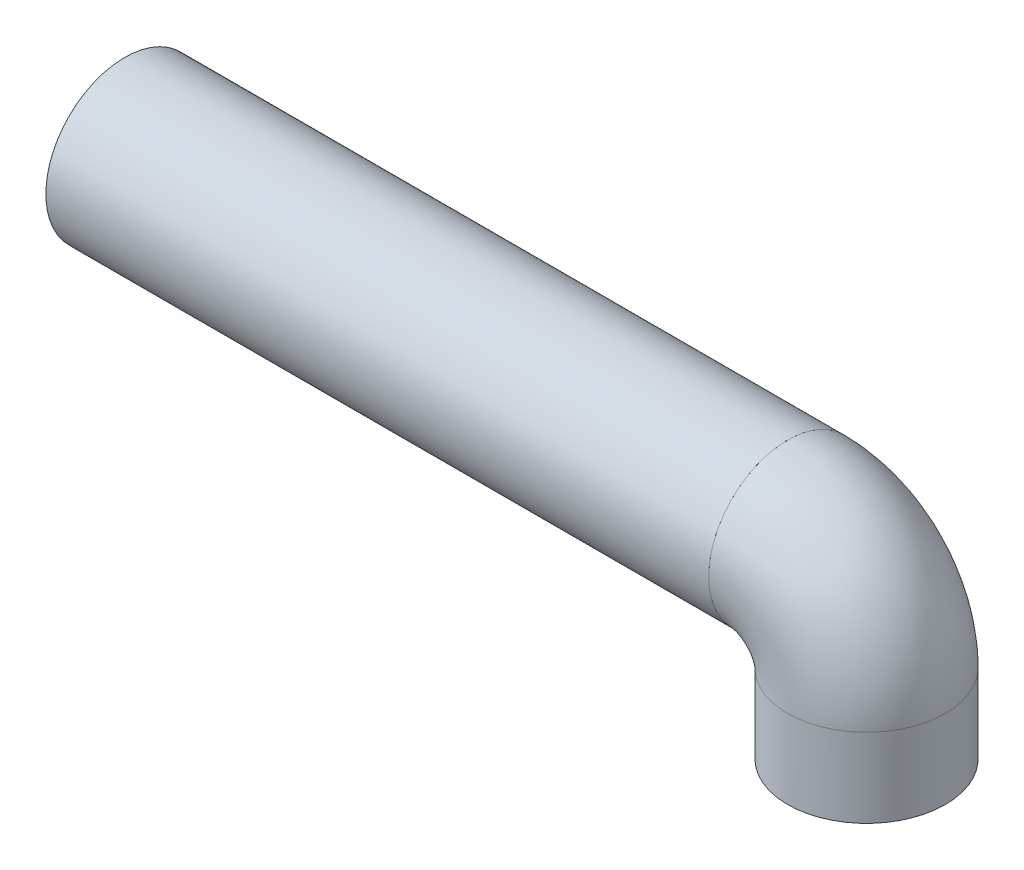
ISO-10303-21;
HEADER;
FILE_DESCRIPTION(('STEP AP214'),'2;1');
FILE_NAME('part.step','',(''),(''),'','','');
FILE_SCHEMA(('AUTOMOTIVE_DESIGN { 1 0 10303 214 1 1 1 1 }'));
ENDSEC;
DATA;
#1=APPLICATION_CONTEXT('core data for automotive mechanical design processes');
#2=APPLICATION_PROTOCOL_DEFINITION('international standard','automotive_design',2000,#1);
#3=PRODUCT_CONTEXT('',#1,'mechanical');
#4=PRODUCT('Part','Part','',(#3));
#5=PRODUCT_RELATED_PRODUCT_CATEGORY('part','',(#4));
#6=PRODUCT_DEFINITION_FORMATION('','',#4);
#7=PRODUCT_DEFINITION_CONTEXT('part definition',#1,'design');
#8=PRODUCT_DEFINITION('design','',#6,#7);
#9=PRODUCT_DEFINITION_SHAPE('','',#8);
#10=(LENGTH_UNIT() NAMED_UNIT(*) SI_UNIT(.MILLI.,.METRE.));
#11=(NAMED_UNIT(*) PLANE_ANGLE_UNIT() SI_UNIT($,.RADIAN.));
#12=(NAMED_UNIT(*) SI_UNIT($,.STERADIAN.) SOLID_ANGLE_UNIT());
#13=UNCERTAINTY_MEASURE_WITH_UNIT(LENGTH_MEASURE(1.E-05),#10,'distance_accuracy_value','');
#14=(GEOMETRIC_REPRESENTATION_CONTEXT(3) GLOBAL_UNCERTAINTY_ASSIGNED_CONTEXT((#13)) GLOBAL_UNIT_ASSIGNED_CONTEXT((#10,
#11,#12)) REPRESENTATION_CONTEXT('',''));
#15=CARTESIAN_POINT('',(0.,0.,0.));
#16=DIRECTION('',(0.,0.,1.));
#17=DIRECTION('',(1.,0.,0.));
#18=AXIS2_PLACEMENT_3D('',#15,#16,#17);
#19=CARTESIAN_POINT('',(42.,-5.,0.));
#20=DIRECTION('',(0.,0.,-1.));
#21=DIRECTION('',(-1.,0.,0.));
#22=AXIS2_PLACEMENT_3D('',#19,#20,#21);
#23=TOROIDAL_SURFACE('',#22,5.,2.5);
#24=CARTESIAN_POINT('',(41.9999999999999,0.,0.));
#25=DIRECTION('',(1.,0.,0.));
#26=DIRECTION('',(0.,1.,0.));
#27=AXIS2_PLACEMENT_3D('',#24,#25,#26);
#28=CIRCLE('',#27,2.5);
#29=CARTESIAN_POINT('',(41.9999999999999,2.5,0.));
#30=VERTEX_POINT('',#29);
#31=EDGE_CURVE('E68',#30,#30,#28,.T.);
#32=CARTESIAN_POINT('',(47.,-5.00000000000003,0.));
#33=DIRECTION('',(0.,1.,0.));
#34=DIRECTION('',(-1.,0.,0.));
#35=AXIS2_PLACEMENT_3D('',#32,#33,#34);
#36=CIRCLE('',#35,2.5);
#37=CARTESIAN_POINT('',(49.5,-5.00000000000005,0.));
#38=VERTEX_POINT('',#37);
#39=EDGE_CURVE('E80',#38,#38,#36,.T.);
#40=CARTESIAN_POINT('',(42.,-5.,0.));
#41=DIRECTION('',(0.,0.,-1.));
#42=DIRECTION('',(-1.,0.,0.));
#43=AXIS2_PLACEMENT_3D('',#40,#41,#42);
#44=CIRCLE('',#43,7.5);
#45=EDGE_CURVE('',#30,#38,#44,.T.);
#46=ORIENTED_EDGE('',*,*,#31,.F.);
#47=ORIENTED_EDGE('',*,*,#39,.F.);
#48=ORIENTED_EDGE('',*,*,#45,.T.);
#49=ORIENTED_EDGE('',*,*,#45,.F.);
#50=EDGE_LOOP('',(#46,#48,#47,#49));
#51=FACE_BOUND('',#50,.T.);
#52=ADVANCED_FACE('F61',(#51),#23,.F.);
#53=CARTESIAN_POINT('',(41.9999999999999,0.,0.));
#54=DIRECTION('',(1.,0.,0.));
#55=DIRECTION('',(0.,1.,0.));
#56=AXIS2_PLACEMENT_3D('',#53,#54,#55);
#57=PLANE('',#56);
#58=ORIENTED_EDGE('',*,*,#31,.T.);
#59=EDGE_LOOP('',(#58));
#60=FACE_BOUND('',#59,.T.);
#61=CARTESIAN_POINT('',(41.9999999999999,0.,0.));
#62=DIRECTION('',(1.,0.,0.));
#63=DIRECTION('',(0.,1.,0.));
#64=AXIS2_PLACEMENT_3D('',#61,#62,#63);
#65=CIRCLE('',#64,5.);
#66=CARTESIAN_POINT('',(42.,-5.,0.));
#67=VERTEX_POINT('',#66);
#68=EDGE_CURVE('E13',#67,#67,#65,.T.);
#69=ORIENTED_EDGE('',*,*,#68,.F.);
#70=EDGE_LOOP('',(#69));
#71=FACE_BOUND('',#70,.T.);
#72=ADVANCED_FACE('F109',(#60,#71),#57,.F.);
#73=CARTESIAN_POINT('',(37.,-5.,0.));
#74=DIRECTION('',(0.,-1.,0.));
#75=DIRECTION('',(-1.,0.,0.));
#76=AXIS2_PLACEMENT_3D('',#73,#74,#75);
#77=CIRCLE('',#76,5.);
#78=TRIMMED_CURVE('',#77,(PARAMETER_VALUE(-3.14159263251637)),
(PARAMETER_VALUE(3.14159263251637)),.T.,.PARAMETER.);
#79=CARTESIAN_POINT('',(42.,-5.,0.));
#80=DIRECTION('',(0.,0.,-1.));
#81=AXIS1_PLACEMENT('',#79,#80);
#82=SURFACE_OF_REVOLUTION('',#78,#81);
#83=ORIENTED_EDGE('',*,*,#68,.T.);
#84=CARTESIAN_POINT('',(47.,-5.00000000000003,0.));
#85=DIRECTION('',(0.,1.,0.));
#86=DIRECTION('',(-1.,0.,0.));
#87=AXIS2_PLACEMENT_3D('',#84,#85,#86);
#88=CIRCLE('',#87,5.);
#89=EDGE_CURVE('E72',#67,#67,#88,.T.);
#90=ORIENTED_EDGE('',*,*,#89,.T.);
#91=EDGE_LOOP('',(#83,#90));
#92=FACE_BOUND('',#91,.T.);
#93=ADVANCED_FACE('F105',(#92),#82,.T.);
#94=CARTESIAN_POINT('',(47.,-9.99999999999998,0.));
#95=DIRECTION('',(0.,1.,0.));
#96=DIRECTION('',(0.,0.,1.));
#97=AXIS2_PLACEMENT_3D('',#94,#95,#96);
#98=CYLINDRICAL_SURFACE('',#97,2.5);
#99=CARTESIAN_POINT('',(47.,-9.99999999999998,0.));
#100=DIRECTION('',(0.,-1.,0.));
#101=DIRECTION('',(1.,0.,0.));
#102=AXIS2_PLACEMENT_3D('',#99,#100,#101);
#103=CIRCLE('',#102,2.5);
#104=CARTESIAN_POINT('',(49.5,-10.,0.));
#105=VERTEX_POINT('',#104);
#106=EDGE_CURVE('E87',#105,#105,#103,.T.);
#107=ORIENTED_EDGE('',*,*,#106,.T.);
#108=EDGE_LOOP('',(#107));
#109=FACE_BOUND('',#108,.T.);
#110=ORIENTED_EDGE('',*,*,#39,.T.);
#111=EDGE_LOOP('',(#110));
#112=FACE_BOUND('',#111,.T.);
#113=ADVANCED_FACE('F91',(#109,#112),#98,.F.);
#114=CARTESIAN_POINT('',(47.,-9.99999999999998,0.));
#115=DIRECTION('',(0.,1.,0.));
#116=DIRECTION('',(0.,0.,1.));
#117=AXIS2_PLACEMENT_3D('',#114,#115,#116);
#118=CYLINDRICAL_SURFACE('',#117,5.);
#119=CARTESIAN_POINT('',(47.,-9.99999999999998,0.));
#120=DIRECTION('',(0.,-1.,0.));
#121=DIRECTION('',(1.,0.,0.));
#122=AXIS2_PLACEMENT_3D('',#119,#120,#121);
#123=CIRCLE('',#122,5.);
#124=CARTESIAN_POINT('',(52.,-10.,0.));
#125=VERTEX_POINT('',#124);
#126=EDGE_CURVE('E75',#125,#125,#123,.T.);
#127=ORIENTED_EDGE('',*,*,#126,.F.);
#128=EDGE_LOOP('',(#127));
#129=FACE_BOUND('',#128,.T.);
#130=ORIENTED_EDGE('',*,*,#89,.F.);
#131=EDGE_LOOP('',(#130));
#132=FACE_BOUND('',#131,.T.);
#133=ADVANCED_FACE('F73',(#129,#132),#118,.T.);
#134=CARTESIAN_POINT('',(47.,-9.99999999999998,0.));
#135=DIRECTION('',(0.,-1.,0.));
#136=DIRECTION('',(1.,0.,0.));
#137=AXIS2_PLACEMENT_3D('',#134,#135,#136);
#138=PLANE('',#137);
#139=ORIENTED_EDGE('',*,*,#106,.F.);
#140=EDGE_LOOP('',(#139));
#141=FACE_BOUND('',#140,.T.);
#142=ORIENTED_EDGE('',*,*,#126,.T.);
#143=EDGE_LOOP('',(#142));
#144=FACE_BOUND('',#143,.T.);
#145=ADVANCED_FACE('F94',(#141,#144),#138,.T.);
#146=CLOSED_SHELL('',(#52,#72,#93,#113,#133,#145));
#147=MANIFOLD_SOLID_BREP('B2',#146);
#148=CARTESIAN_POINT('',(41.9999999999999,0.,0.));
#149=DIRECTION('',(-1.,0.,0.));
#150=DIRECTION('',(0.,0.,1.));
#151=AXIS2_PLACEMENT_3D('',#148,#149,#150);
#152=CYLINDRICAL_SURFACE('',#151,2.5);
#153=CARTESIAN_POINT('',(41.9999999999999,0.,0.));
#154=DIRECTION('',(1.,0.,0.));
#155=DIRECTION('',(0.,0.,-1.));
#156=AXIS2_PLACEMENT_3D('',#153,#154,#155);
#157=CIRCLE('',#156,2.5);
#158=CARTESIAN_POINT('',(41.9999999999999,0.,-2.5));
#159=VERTEX_POINT('',#158);
#160=EDGE_CURVE('E188',#159,#159,#157,.T.);
#161=ORIENTED_EDGE('',*,*,#160,.T.);
#162=EDGE_LOOP('',(#161));
#163=FACE_BOUND('',#162,.T.);
#164=CARTESIAN_POINT('',(0.,0.,0.));
#165=DIRECTION('',(1.,0.,0.));
#166=DIRECTION('',(0.,0.,-1.));
#167=AXIS2_PLACEMENT_3D('',#164,#165,#166);
#168=CIRCLE('',#167,2.5);
#169=CARTESIAN_POINT('',(0.,0.,-2.5));
#170=VERTEX_POINT('',#169);
#171=EDGE_CURVE('E195',#170,#170,#168,.T.);
#172=ORIENTED_EDGE('',*,*,#171,.F.);
#173=EDGE_LOOP('',(#172));
#174=FACE_BOUND('',#173,.T.);
#175=ADVANCED_FACE('F180',(#163,#174),#152,.F.);
#176=CARTESIAN_POINT('',(41.9999999999999,0.,0.));
#177=DIRECTION('',(-1.,0.,0.));
#178=DIRECTION('',(0.,0.,1.));
#179=AXIS2_PLACEMENT_3D('',#176,#177,#178);
#180=CYLINDRICAL_SURFACE('',#179,5.);
#181=CARTESIAN_POINT('',(41.9999999999999,0.,0.));
#182=DIRECTION('',(1.,0.,0.));
#183=DIRECTION('',(0.,0.,-1.));
#184=AXIS2_PLACEMENT_3D('',#181,#182,#183);
#185=CIRCLE('',#184,5.);
#186=CARTESIAN_POINT('',(41.9999999999999,0.,-5.));
#187=VERTEX_POINT('',#186);
#188=EDGE_CURVE('E60',#187,#187,#185,.T.);
#189=ORIENTED_EDGE('',*,*,#188,.F.);
#190=EDGE_LOOP('',(#189));
#191=FACE_BOUND('',#190,.T.);
#192=CARTESIAN_POINT('',(0.,0.,0.));
#193=DIRECTION('',(1.,0.,0.));
#194=DIRECTION('',(0.,0.,-1.));
#195=AXIS2_PLACEMENT_3D('',#192,#193,#194);
#196=CIRCLE('',#195,5.);
#197=CARTESIAN_POINT('',(0.,0.,-5.));
#198=VERTEX_POINT('',#197);
#199=EDGE_CURVE('E183',#198,#198,#196,.T.);
#200=ORIENTED_EDGE('',*,*,#199,.T.);
#201=EDGE_LOOP('',(#200));
#202=FACE_BOUND('',#201,.T.);
#203=ADVANCED_FACE('F204',(#191,#202),#180,.T.);
#204=CARTESIAN_POINT('',(41.9999999999999,0.,0.));
#205=DIRECTION('',(1.,0.,0.));
#206=DIRECTION('',(0.,0.,-1.));
#207=AXIS2_PLACEMENT_3D('',#204,#205,#206);
#208=PLANE('',#207);
#209=ORIENTED_EDGE('',*,*,#160,.F.);
#210=EDGE_LOOP('',(#209));
#211=FACE_BOUND('',#210,.T.);
#212=ORIENTED_EDGE('',*,*,#188,.T.);
#213=EDGE_LOOP('',(#212));
#214=FACE_BOUND('',#213,.T.);
#215=ADVANCED_FACE('F208',(#211,#214),#208,.T.);
#216=CARTESIAN_POINT('',(0.,0.,0.));
#217=DIRECTION('',(1.,0.,0.));
#218=DIRECTION('',(0.,0.,-1.));
#219=AXIS2_PLACEMENT_3D('',#216,#217,#218);
#220=PLANE('',#219);
#221=ORIENTED_EDGE('',*,*,#171,.T.);
#222=EDGE_LOOP('',(#221));
#223=FACE_BOUND('',#222,.T.);
#224=ORIENTED_EDGE('',*,*,#199,.F.);
#225=EDGE_LOOP('',(#224));
#226=FACE_BOUND('',#225,.T.);
#227=ADVANCED_FACE('F206',(#223,#226),#220,.F.);
#228=CLOSED_SHELL('',(#175,#203,#215,#227));
#229=MANIFOLD_SOLID_BREP('B7',#228);
#230=ADVANCED_BREP_SHAPE_REPRESENTATION('',(#18,#147,#229),#14);
#231=SHAPE_DEFINITION_REPRESENTATION(#9,#230);
ENDSEC;
END-ISO-10303-21;
